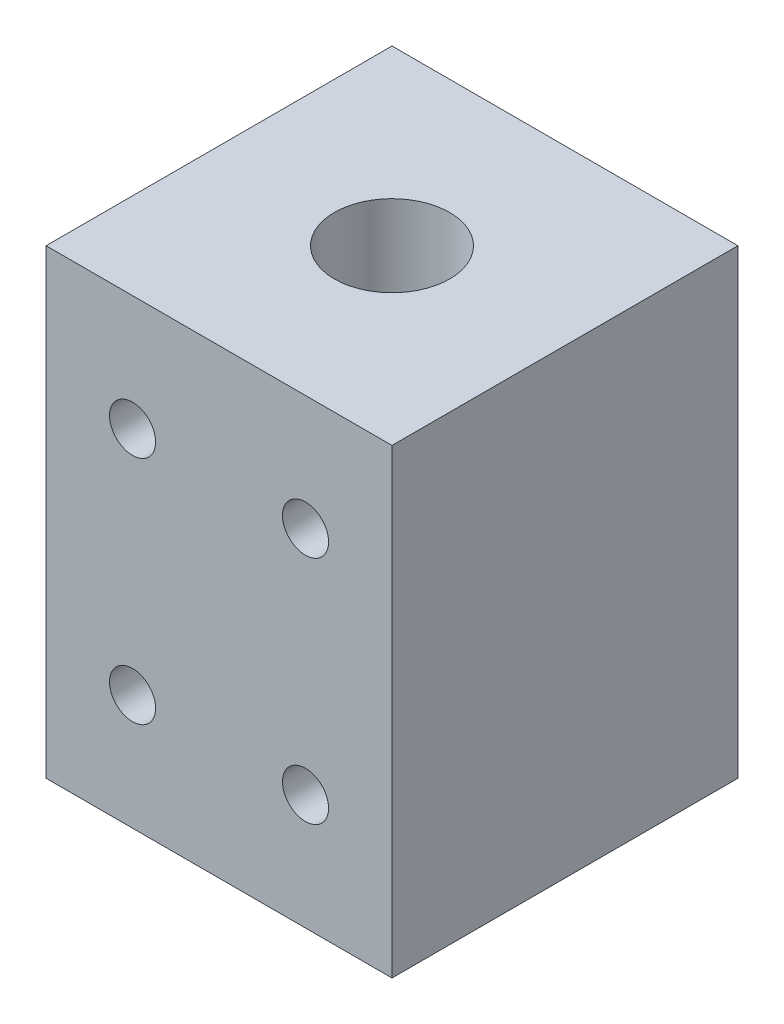
ISO-10303-21;
HEADER;
FILE_DESCRIPTION(('STEP AP214'),'2;1');
FILE_NAME('part.step','',(''),(''),'','','');
FILE_SCHEMA(('AUTOMOTIVE_DESIGN { 1 0 10303 214 1 1 1 1 }'));
ENDSEC;
DATA;
#1=APPLICATION_CONTEXT('core data for automotive mechanical design processes');
#2=APPLICATION_PROTOCOL_DEFINITION('international standard','automotive_design',2000,#1);
#3=PRODUCT_CONTEXT('',#1,'mechanical');
#4=PRODUCT('Part','Part','',(#3));
#5=PRODUCT_RELATED_PRODUCT_CATEGORY('part','',(#4));
#6=PRODUCT_DEFINITION_FORMATION('','',#4);
#7=PRODUCT_DEFINITION_CONTEXT('part definition',#1,'design');
#8=PRODUCT_DEFINITION('design','',#6,#7);
#9=PRODUCT_DEFINITION_SHAPE('','',#8);
#10=(LENGTH_UNIT() NAMED_UNIT(*) SI_UNIT(.MILLI.,.METRE.));
#11=(NAMED_UNIT(*) PLANE_ANGLE_UNIT() SI_UNIT($,.RADIAN.));
#12=(NAMED_UNIT(*) SI_UNIT($,.STERADIAN.) SOLID_ANGLE_UNIT());
#13=UNCERTAINTY_MEASURE_WITH_UNIT(LENGTH_MEASURE(1.E-05),#10,'distance_accuracy_value','');
#14=(GEOMETRIC_REPRESENTATION_CONTEXT(3) GLOBAL_UNCERTAINTY_ASSIGNED_CONTEXT((#13)) GLOBAL_UNIT_ASSIGNED_CONTEXT((#10,
#11,#12)) REPRESENTATION_CONTEXT('',''));
#15=CARTESIAN_POINT('',(0.,0.,0.));
#16=DIRECTION('',(0.,0.,1.));
#17=DIRECTION('',(1.,0.,0.));
#18=AXIS2_PLACEMENT_3D('',#15,#16,#17);
#19=CARTESIAN_POINT('',(0.,80.,0.));
#20=DIRECTION('',(0.,1.,0.));
#21=DIRECTION('',(0.,0.,1.));
#22=AXIS2_PLACEMENT_3D('',#19,#20,#21);
#23=PLANE('',#22);
#24=DIRECTION('',(0.,0.,1.));
#25=VECTOR('',#24,1.);
#26=CARTESIAN_POINT('',(-30.,80.,30.));
#27=LINE('',#26,#25);
#28=CARTESIAN_POINT('',(-30.,80.,-30.));
#29=VERTEX_POINT('',#28);
#30=CARTESIAN_POINT('',(-30.,80.,30.));
#31=VERTEX_POINT('',#30);
#32=EDGE_CURVE('E85',#29,#31,#27,.T.);
#33=ORIENTED_EDGE('',*,*,#32,.T.);
#34=DIRECTION('',(1.,0.,0.));
#35=VECTOR('',#34,1.);
#36=CARTESIAN_POINT('',(30.,80.,30.));
#37=LINE('',#36,#35);
#38=CARTESIAN_POINT('',(30.,80.,30.));
#39=VERTEX_POINT('',#38);
#40=EDGE_CURVE('E80',#31,#39,#37,.T.);
#41=ORIENTED_EDGE('',*,*,#40,.T.);
#42=DIRECTION('',(0.,0.,-1.));
#43=VECTOR('',#42,1.);
#44=CARTESIAN_POINT('',(30.,80.,30.));
#45=LINE('',#44,#43);
#46=CARTESIAN_POINT('',(30.,80.,-30.));
#47=VERTEX_POINT('',#46);
#48=EDGE_CURVE('E83',#39,#47,#45,.T.);
#49=ORIENTED_EDGE('',*,*,#48,.T.);
#50=DIRECTION('',(-1.,0.,0.));
#51=VECTOR('',#50,1.);
#52=CARTESIAN_POINT('',(30.,80.,-30.));
#53=LINE('',#52,#51);
#54=EDGE_CURVE('E50',#47,#29,#53,.T.);
#55=ORIENTED_EDGE('',*,*,#54,.T.);
#56=EDGE_LOOP('',(#33,#41,#49,#55));
#57=FACE_BOUND('',#56,.T.);
#58=CARTESIAN_POINT('',(0.,80.,0.));
#59=DIRECTION('',(0.,1.,0.));
#60=DIRECTION('',(0.,0.,1.));
#61=AXIS2_PLACEMENT_3D('',#58,#59,#60);
#62=CIRCLE('',#61,10.);
#63=CARTESIAN_POINT('',(0.,80.,9.99999999999999));
#64=VERTEX_POINT('',#63);
#65=EDGE_CURVE('E100',#64,#64,#62,.T.);
#66=ORIENTED_EDGE('',*,*,#65,.F.);
#67=EDGE_LOOP('',(#66));
#68=FACE_BOUND('',#67,.T.);
#69=ADVANCED_FACE('F33',(#57,#68),#23,.T.);
#70=CARTESIAN_POINT('',(0.,0.,0.));
#71=DIRECTION('',(0.,1.,0.));
#72=DIRECTION('',(0.,0.,1.));
#73=AXIS2_PLACEMENT_3D('',#70,#71,#72);
#74=PLANE('',#73);
#75=DIRECTION('',(0.,0.,1.));
#76=VECTOR('',#75,1.);
#77=CARTESIAN_POINT('',(-30.,0.,30.));
#78=LINE('',#77,#76);
#79=CARTESIAN_POINT('',(-30.,0.,-30.));
#80=VERTEX_POINT('',#79);
#81=CARTESIAN_POINT('',(-30.,0.,30.));
#82=VERTEX_POINT('',#81);
#83=EDGE_CURVE('E97',#80,#82,#78,.T.);
#84=ORIENTED_EDGE('',*,*,#83,.F.);
#85=DIRECTION('',(-1.,0.,0.));
#86=VECTOR('',#85,1.);
#87=CARTESIAN_POINT('',(30.,0.,-30.));
#88=LINE('',#87,#86);
#89=CARTESIAN_POINT('',(30.,0.,-30.));
#90=VERTEX_POINT('',#89);
#91=EDGE_CURVE('E73',#90,#80,#88,.T.);
#92=ORIENTED_EDGE('',*,*,#91,.F.);
#93=DIRECTION('',(0.,0.,-1.));
#94=VECTOR('',#93,1.);
#95=CARTESIAN_POINT('',(30.,0.,30.));
#96=LINE('',#95,#94);
#97=CARTESIAN_POINT('',(30.,0.,30.));
#98=VERTEX_POINT('',#97);
#99=EDGE_CURVE('E67',#98,#90,#96,.T.);
#100=ORIENTED_EDGE('',*,*,#99,.F.);
#101=DIRECTION('',(1.,0.,0.));
#102=VECTOR('',#101,1.);
#103=CARTESIAN_POINT('',(30.,0.,30.));
#104=LINE('',#103,#102);
#105=EDGE_CURVE('E89',#82,#98,#104,.T.);
#106=ORIENTED_EDGE('',*,*,#105,.F.);
#107=EDGE_LOOP('',(#84,#92,#100,#106));
#108=FACE_BOUND('',#107,.T.);
#109=CARTESIAN_POINT('',(0.,0.,0.));
#110=DIRECTION('',(0.,1.,0.));
#111=DIRECTION('',(0.,0.,1.));
#112=AXIS2_PLACEMENT_3D('',#109,#110,#111);
#113=CIRCLE('',#112,10.);
#114=CARTESIAN_POINT('',(0.,0.,9.99999999999999));
#115=VERTEX_POINT('',#114);
#116=EDGE_CURVE('E112',#115,#115,#113,.T.);
#117=ORIENTED_EDGE('',*,*,#116,.T.);
#118=EDGE_LOOP('',(#117));
#119=FACE_BOUND('',#118,.T.);
#120=ADVANCED_FACE('F108',(#108,#119),#74,.F.);
#121=CARTESIAN_POINT('',(-30.,80.,30.));
#122=DIRECTION('',(1.,0.,0.));
#123=DIRECTION('',(0.,0.,-1.));
#124=AXIS2_PLACEMENT_3D('',#121,#122,#123);
#125=PLANE('',#124);
#126=ORIENTED_EDGE('',*,*,#83,.T.);
#127=DIRECTION('',(0.,-1.,0.));
#128=VECTOR('',#127,1.);
#129=CARTESIAN_POINT('',(-30.,80.,30.));
#130=LINE('',#129,#128);
#131=EDGE_CURVE('E11',#31,#82,#130,.T.);
#132=ORIENTED_EDGE('',*,*,#131,.F.);
#133=ORIENTED_EDGE('',*,*,#32,.F.);
#134=DIRECTION('',(0.,-1.,0.));
#135=VECTOR('',#134,1.);
#136=CARTESIAN_POINT('',(-30.,80.,-30.));
#137=LINE('',#136,#135);
#138=EDGE_CURVE('E93',#29,#80,#137,.T.);
#139=ORIENTED_EDGE('',*,*,#138,.T.);
#140=EDGE_LOOP('',(#126,#132,#133,#139));
#141=FACE_BOUND('',#140,.T.);
#142=ADVANCED_FACE('F35',(#141),#125,.F.);
#143=CARTESIAN_POINT('',(30.,80.,30.));
#144=DIRECTION('',(0.,0.,-1.));
#145=DIRECTION('',(-1.,0.,0.));
#146=AXIS2_PLACEMENT_3D('',#143,#144,#145);
#147=PLANE('',#146);
#148=CARTESIAN_POINT('',(15.,60.,30.));
#149=DIRECTION('',(0.,0.,1.));
#150=DIRECTION('',(1.,0.,0.));
#151=AXIS2_PLACEMENT_3D('',#148,#149,#150);
#152=CIRCLE('',#151,3.99999999999999);
#153=CARTESIAN_POINT('',(19.,60.,30.));
#154=VERTEX_POINT('',#153);
#155=EDGE_CURVE('E136',#154,#154,#152,.T.);
#156=ORIENTED_EDGE('',*,*,#155,.F.);
#157=EDGE_LOOP('',(#156));
#158=FACE_BOUND('',#157,.T.);
#159=CARTESIAN_POINT('',(-15.,20.,30.));
#160=DIRECTION('',(0.,0.,1.));
#161=DIRECTION('',(1.,0.,0.));
#162=AXIS2_PLACEMENT_3D('',#159,#160,#161);
#163=CIRCLE('',#162,4.);
#164=CARTESIAN_POINT('',(-11.,20.,30.));
#165=VERTEX_POINT('',#164);
#166=EDGE_CURVE('E130',#165,#165,#163,.T.);
#167=ORIENTED_EDGE('',*,*,#166,.F.);
#168=EDGE_LOOP('',(#167));
#169=FACE_BOUND('',#168,.T.);
#170=CARTESIAN_POINT('',(15.,20.,30.));
#171=DIRECTION('',(0.,0.,1.));
#172=DIRECTION('',(1.,0.,0.));
#173=AXIS2_PLACEMENT_3D('',#170,#171,#172);
#174=CIRCLE('',#173,4.);
#175=CARTESIAN_POINT('',(19.,20.,30.));
#176=VERTEX_POINT('',#175);
#177=EDGE_CURVE('E124',#176,#176,#174,.T.);
#178=ORIENTED_EDGE('',*,*,#177,.F.);
#179=EDGE_LOOP('',(#178));
#180=FACE_BOUND('',#179,.T.);
#181=CARTESIAN_POINT('',(-15.,60.,30.));
#182=DIRECTION('',(0.,0.,1.));
#183=DIRECTION('',(1.,0.,0.));
#184=AXIS2_PLACEMENT_3D('',#181,#182,#183);
#185=CIRCLE('',#184,4.);
#186=CARTESIAN_POINT('',(-11.,60.,30.));
#187=VERTEX_POINT('',#186);
#188=EDGE_CURVE('E118',#187,#187,#185,.T.);
#189=ORIENTED_EDGE('',*,*,#188,.F.);
#190=EDGE_LOOP('',(#189));
#191=FACE_BOUND('',#190,.T.);
#192=ORIENTED_EDGE('',*,*,#105,.T.);
#193=DIRECTION('',(0.,-1.,0.));
#194=VECTOR('',#193,1.);
#195=CARTESIAN_POINT('',(30.,80.,30.));
#196=LINE('',#195,#194);
#197=EDGE_CURVE('E42',#39,#98,#196,.T.);
#198=ORIENTED_EDGE('',*,*,#197,.F.);
#199=ORIENTED_EDGE('',*,*,#40,.F.);
#200=ORIENTED_EDGE('',*,*,#131,.T.);
#201=EDGE_LOOP('',(#192,#198,#199,#200));
#202=FACE_BOUND('',#201,.T.);
#203=ADVANCED_FACE('F88',(#158,#169,#180,#191,#202),#147,.F.);
#204=CARTESIAN_POINT('',(30.,80.,30.));
#205=DIRECTION('',(-1.,0.,0.));
#206=DIRECTION('',(0.,0.,1.));
#207=AXIS2_PLACEMENT_3D('',#204,#205,#206);
#208=PLANE('',#207);
#209=ORIENTED_EDGE('',*,*,#99,.T.);
#210=DIRECTION('',(0.,-1.,0.));
#211=VECTOR('',#210,1.);
#212=CARTESIAN_POINT('',(30.,80.,-30.));
#213=LINE('',#212,#211);
#214=EDGE_CURVE('E90',#47,#90,#213,.T.);
#215=ORIENTED_EDGE('',*,*,#214,.F.);
#216=ORIENTED_EDGE('',*,*,#48,.F.);
#217=ORIENTED_EDGE('',*,*,#197,.T.);
#218=EDGE_LOOP('',(#209,#215,#216,#217));
#219=FACE_BOUND('',#218,.T.);
#220=ADVANCED_FACE('F91',(#219),#208,.F.);
#221=CARTESIAN_POINT('',(30.,80.,-30.));
#222=DIRECTION('',(0.,0.,1.));
#223=DIRECTION('',(1.,0.,0.));
#224=AXIS2_PLACEMENT_3D('',#221,#222,#223);
#225=PLANE('',#224);
#226=ORIENTED_EDGE('',*,*,#91,.T.);
#227=ORIENTED_EDGE('',*,*,#138,.F.);
#228=ORIENTED_EDGE('',*,*,#54,.F.);
#229=ORIENTED_EDGE('',*,*,#214,.T.);
#230=EDGE_LOOP('',(#226,#227,#228,#229));
#231=FACE_BOUND('',#230,.T.);
#232=ADVANCED_FACE('F105',(#231),#225,.F.);
#233=CARTESIAN_POINT('',(0.,80.,0.));
#234=DIRECTION('',(0.,-1.,0.));
#235=DIRECTION('',(0.,0.,-1.));
#236=AXIS2_PLACEMENT_3D('',#233,#234,#235);
#237=CYLINDRICAL_SURFACE('',#236,10.);
#238=ORIENTED_EDGE('',*,*,#65,.T.);
#239=EDGE_LOOP('',(#238));
#240=FACE_BOUND('',#239,.T.);
#241=ORIENTED_EDGE('',*,*,#116,.F.);
#242=EDGE_LOOP('',(#241));
#243=FACE_BOUND('',#242,.T.);
#244=ADVANCED_FACE('F162',(#240,#243),#237,.F.);
#245=CARTESIAN_POINT('',(-15.,60.,9.99999999999999));
#246=DIRECTION('',(0.,0.,1.));
#247=DIRECTION('',(1.,0.,0.));
#248=AXIS2_PLACEMENT_3D('',#245,#246,#247);
#249=CYLINDRICAL_SURFACE('',#248,4.);
#250=CARTESIAN_POINT('',(-15.,60.,9.99999999999999));
#251=DIRECTION('',(0.,0.,1.));
#252=DIRECTION('',(1.,0.,0.));
#253=AXIS2_PLACEMENT_3D('',#250,#251,#252);
#254=CIRCLE('',#253,4.);
#255=CARTESIAN_POINT('',(-11.,60.,9.99999999999999));
#256=VERTEX_POINT('',#255);
#257=EDGE_CURVE('E115',#256,#256,#254,.T.);
#258=ORIENTED_EDGE('',*,*,#257,.F.);
#259=EDGE_LOOP('',(#258));
#260=FACE_BOUND('',#259,.T.);
#261=ORIENTED_EDGE('',*,*,#188,.T.);
#262=EDGE_LOOP('',(#261));
#263=FACE_BOUND('',#262,.T.);
#264=ADVANCED_FACE('F159',(#260,#263),#249,.F.);
#265=CARTESIAN_POINT('',(-15.,60.,9.99999999999999));
#266=DIRECTION('',(0.,0.,1.));
#267=DIRECTION('',(1.,0.,0.));
#268=AXIS2_PLACEMENT_3D('',#265,#266,#267);
#269=PLANE('',#268);
#270=ORIENTED_EDGE('',*,*,#257,.T.);
#271=EDGE_LOOP('',(#270));
#272=FACE_BOUND('',#271,.T.);
#273=ADVANCED_FACE('F161',(#272),#269,.T.);
#274=CARTESIAN_POINT('',(15.,20.,9.99999999999999));
#275=DIRECTION('',(0.,0.,1.));
#276=DIRECTION('',(1.,0.,0.));
#277=AXIS2_PLACEMENT_3D('',#274,#275,#276);
#278=CYLINDRICAL_SURFACE('',#277,4.);
#279=CARTESIAN_POINT('',(15.,20.,9.99999999999999));
#280=DIRECTION('',(0.,0.,1.));
#281=DIRECTION('',(1.,0.,0.));
#282=AXIS2_PLACEMENT_3D('',#279,#280,#281);
#283=CIRCLE('',#282,4.);
#284=CARTESIAN_POINT('',(19.,20.,9.99999999999999));
#285=VERTEX_POINT('',#284);
#286=EDGE_CURVE('E127',#285,#285,#283,.T.);
#287=ORIENTED_EDGE('',*,*,#286,.F.);
#288=EDGE_LOOP('',(#287));
#289=FACE_BOUND('',#288,.T.);
#290=ORIENTED_EDGE('',*,*,#177,.T.);
#291=EDGE_LOOP('',(#290));
#292=FACE_BOUND('',#291,.T.);
#293=ADVANCED_FACE('F169',(#289,#292),#278,.F.);
#294=CARTESIAN_POINT('',(15.,20.,9.99999999999999));
#295=DIRECTION('',(0.,0.,1.));
#296=DIRECTION('',(1.,0.,0.));
#297=AXIS2_PLACEMENT_3D('',#294,#295,#296);
#298=PLANE('',#297);
#299=ORIENTED_EDGE('',*,*,#286,.T.);
#300=EDGE_LOOP('',(#299));
#301=FACE_BOUND('',#300,.T.);
#302=ADVANCED_FACE('F223',(#301),#298,.T.);
#303=CARTESIAN_POINT('',(-15.,20.,9.99999999999999));
#304=DIRECTION('',(0.,0.,1.));
#305=DIRECTION('',(1.,0.,0.));
#306=AXIS2_PLACEMENT_3D('',#303,#304,#305);
#307=CYLINDRICAL_SURFACE('',#306,4.);
#308=CARTESIAN_POINT('',(-15.,20.,9.99999999999999));
#309=DIRECTION('',(0.,0.,1.));
#310=DIRECTION('',(1.,0.,0.));
#311=AXIS2_PLACEMENT_3D('',#308,#309,#310);
#312=CIRCLE('',#311,4.);
#313=CARTESIAN_POINT('',(-11.,20.,9.99999999999999));
#314=VERTEX_POINT('',#313);
#315=EDGE_CURVE('E133',#314,#314,#312,.T.);
#316=ORIENTED_EDGE('',*,*,#315,.F.);
#317=EDGE_LOOP('',(#316));
#318=FACE_BOUND('',#317,.T.);
#319=ORIENTED_EDGE('',*,*,#166,.T.);
#320=EDGE_LOOP('',(#319));
#321=FACE_BOUND('',#320,.T.);
#322=ADVANCED_FACE('F233',(#318,#321),#307,.F.);
#323=CARTESIAN_POINT('',(-15.,20.,9.99999999999999));
#324=DIRECTION('',(0.,0.,1.));
#325=DIRECTION('',(1.,0.,0.));
#326=AXIS2_PLACEMENT_3D('',#323,#324,#325);
#327=PLANE('',#326);
#328=ORIENTED_EDGE('',*,*,#315,.T.);
#329=EDGE_LOOP('',(#328));
#330=FACE_BOUND('',#329,.T.);
#331=ADVANCED_FACE('F147',(#330),#327,.T.);
#332=CARTESIAN_POINT('',(15.,60.,9.99999999999999));
#333=DIRECTION('',(0.,0.,1.));
#334=DIRECTION('',(1.,0.,0.));
#335=AXIS2_PLACEMENT_3D('',#332,#333,#334);
#336=CYLINDRICAL_SURFACE('',#335,3.99999999999999);
#337=CARTESIAN_POINT('',(15.,60.,9.99999999999999));
#338=DIRECTION('',(0.,0.,1.));
#339=DIRECTION('',(1.,0.,0.));
#340=AXIS2_PLACEMENT_3D('',#337,#338,#339);
#341=CIRCLE('',#340,3.99999999999999);
#342=CARTESIAN_POINT('',(19.,60.,9.99999999999999));
#343=VERTEX_POINT('',#342);
#344=EDGE_CURVE('E121',#343,#343,#341,.T.);
#345=ORIENTED_EDGE('',*,*,#344,.F.);
#346=EDGE_LOOP('',(#345));
#347=FACE_BOUND('',#346,.T.);
#348=ORIENTED_EDGE('',*,*,#155,.T.);
#349=EDGE_LOOP('',(#348));
#350=FACE_BOUND('',#349,.T.);
#351=ADVANCED_FACE('F144',(#347,#350),#336,.F.);
#352=CARTESIAN_POINT('',(15.,60.,9.99999999999999));
#353=DIRECTION('',(0.,0.,1.));
#354=DIRECTION('',(1.,0.,0.));
#355=AXIS2_PLACEMENT_3D('',#352,#353,#354);
#356=PLANE('',#355);
#357=ORIENTED_EDGE('',*,*,#344,.T.);
#358=EDGE_LOOP('',(#357));
#359=FACE_BOUND('',#358,.T.);
#360=ADVANCED_FACE('F142',(#359),#356,.T.);
#361=CLOSED_SHELL('',(#69,#120,#142,#203,#220,#232,#244,#264,#273,#293,#302,#322,#331,#351,#360));
#362=MANIFOLD_SOLID_BREP('B2',#361);
#363=ADVANCED_BREP_SHAPE_REPRESENTATION('',(#18,#362),#14);
#364=SHAPE_DEFINITION_REPRESENTATION(#9,#363);
ENDSEC;
END-ISO-10303-21;
